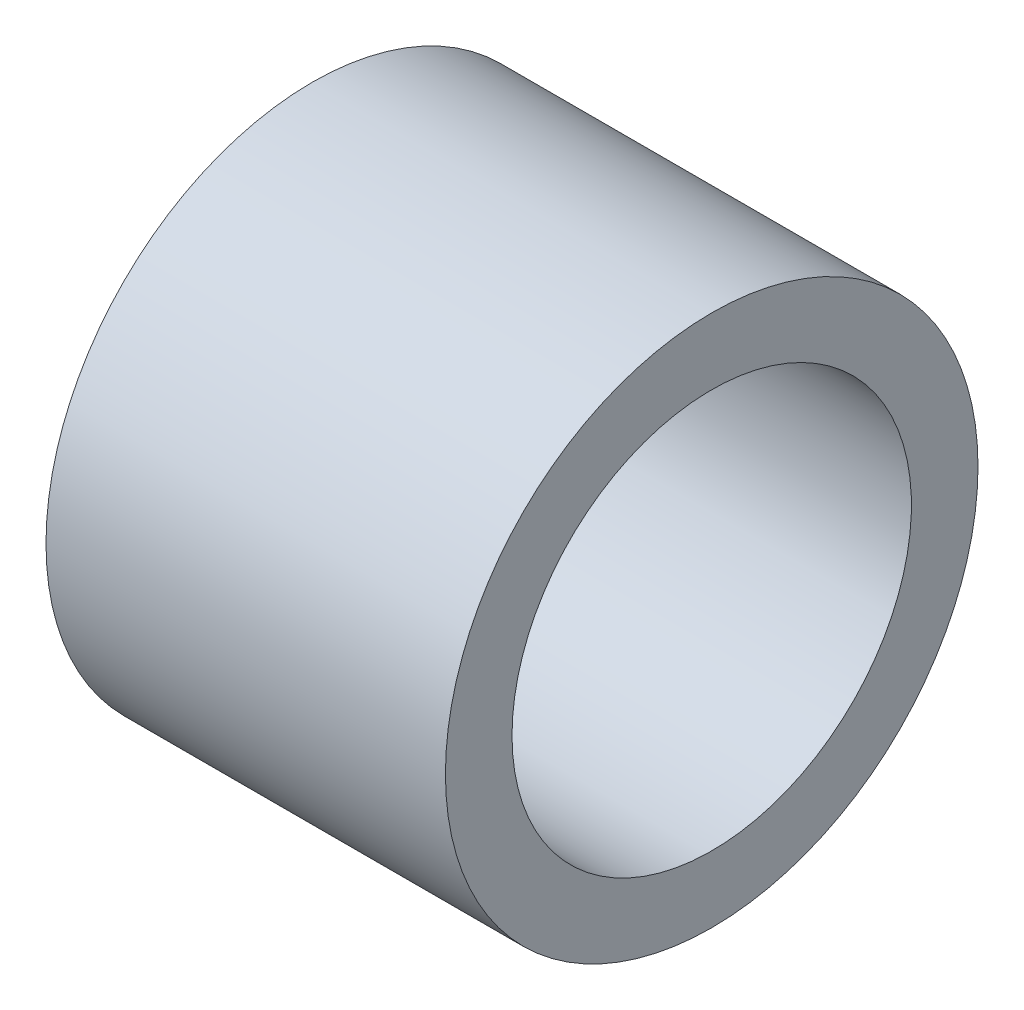
ISO-10303-21;
HEADER;
FILE_DESCRIPTION(('STEP AP214'),'2;1');
FILE_NAME('part.step','',(''),(''),'','','');
FILE_SCHEMA(('AUTOMOTIVE_DESIGN { 1 0 10303 214 1 1 1 1 }'));
ENDSEC;
DATA;
#1=APPLICATION_CONTEXT('core data for automotive mechanical design processes');
#2=APPLICATION_PROTOCOL_DEFINITION('international standard','automotive_design',2000,#1);
#3=PRODUCT_CONTEXT('',#1,'mechanical');
#4=PRODUCT('Part','Part','',(#3));
#5=PRODUCT_RELATED_PRODUCT_CATEGORY('part','',(#4));
#6=PRODUCT_DEFINITION_FORMATION('','',#4);
#7=PRODUCT_DEFINITION_CONTEXT('part definition',#1,'design');
#8=PRODUCT_DEFINITION('design','',#6,#7);
#9=PRODUCT_DEFINITION_SHAPE('','',#8);
#10=(LENGTH_UNIT() NAMED_UNIT(*) SI_UNIT(.MILLI.,.METRE.));
#11=(NAMED_UNIT(*) PLANE_ANGLE_UNIT() SI_UNIT($,.RADIAN.));
#12=(NAMED_UNIT(*) SI_UNIT($,.STERADIAN.) SOLID_ANGLE_UNIT());
#13=UNCERTAINTY_MEASURE_WITH_UNIT(LENGTH_MEASURE(1.E-05),#10,'distance_accuracy_value','');
#14=(GEOMETRIC_REPRESENTATION_CONTEXT(3) GLOBAL_UNCERTAINTY_ASSIGNED_CONTEXT((#13)) GLOBAL_UNIT_ASSIGNED_CONTEXT((#10,
#11,#12)) REPRESENTATION_CONTEXT('',''));
#15=CARTESIAN_POINT('',(0.,0.,0.));
#16=DIRECTION('',(0.,0.,1.));
#17=DIRECTION('',(1.,0.,0.));
#18=AXIS2_PLACEMENT_3D('',#15,#16,#17);
#19=CARTESIAN_POINT('',(9.525,0.,0.));
#20=DIRECTION('',(1.,0.,0.));
#21=DIRECTION('',(0.,0.,-1.));
#22=AXIS2_PLACEMENT_3D('',#19,#20,#21);
#23=PLANE('',#22);
#24=CARTESIAN_POINT('',(9.525,0.,0.));
#25=DIRECTION('',(1.,0.,0.));
#26=DIRECTION('',(0.,0.,-1.));
#27=AXIS2_PLACEMENT_3D('',#24,#25,#26);
#28=CIRCLE('',#27,12.7);
#29=CARTESIAN_POINT('',(9.525,0.,12.7));
#30=VERTEX_POINT('',#29);
#31=EDGE_CURVE('E10',#30,#30,#28,.T.);
#32=ORIENTED_EDGE('',*,*,#31,.T.);
#33=EDGE_LOOP('',(#32));
#34=FACE_BOUND('',#33,.T.);
#35=CARTESIAN_POINT('',(9.525,0.,0.));
#36=DIRECTION('',(1.,0.,0.));
#37=DIRECTION('',(0.,0.,-1.));
#38=AXIS2_PLACEMENT_3D('',#35,#36,#37);
#39=CIRCLE('',#38,9.525);
#40=CARTESIAN_POINT('',(9.525,0.,9.525));
#41=VERTEX_POINT('',#40);
#42=EDGE_CURVE('E56',#41,#41,#39,.T.);
#43=ORIENTED_EDGE('',*,*,#42,.F.);
#44=EDGE_LOOP('',(#43));
#45=FACE_BOUND('',#44,.T.);
#46=ADVANCED_FACE('F43',(#34,#45),#23,.T.);
#47=CARTESIAN_POINT('',(-9.525,0.,0.));
#48=DIRECTION('',(1.,0.,0.));
#49=DIRECTION('',(0.,0.,-1.));
#50=AXIS2_PLACEMENT_3D('',#47,#48,#49);
#51=PLANE('',#50);
#52=CARTESIAN_POINT('',(-9.525,0.,0.));
#53=DIRECTION('',(1.,0.,0.));
#54=DIRECTION('',(0.,0.,-1.));
#55=AXIS2_PLACEMENT_3D('',#52,#53,#54);
#56=CIRCLE('',#55,12.7);
#57=CARTESIAN_POINT('',(-9.525,0.,12.7));
#58=VERTEX_POINT('',#57);
#59=EDGE_CURVE('E47',#58,#58,#56,.T.);
#60=ORIENTED_EDGE('',*,*,#59,.F.);
#61=EDGE_LOOP('',(#60));
#62=FACE_BOUND('',#61,.T.);
#63=CARTESIAN_POINT('',(-9.525,0.,0.));
#64=DIRECTION('',(1.,0.,0.));
#65=DIRECTION('',(0.,0.,-1.));
#66=AXIS2_PLACEMENT_3D('',#63,#64,#65);
#67=CIRCLE('',#66,9.525);
#68=CARTESIAN_POINT('',(-9.525,0.,9.525));
#69=VERTEX_POINT('',#68);
#70=EDGE_CURVE('E58',#69,#69,#67,.T.);
#71=ORIENTED_EDGE('',*,*,#70,.T.);
#72=EDGE_LOOP('',(#71));
#73=FACE_BOUND('',#72,.T.);
#74=ADVANCED_FACE('F70',(#62,#73),#51,.F.);
#75=CARTESIAN_POINT('',(9.525,0.,0.));
#76=DIRECTION('',(-1.,0.,0.));
#77=DIRECTION('',(0.,0.,1.));
#78=AXIS2_PLACEMENT_3D('',#75,#76,#77);
#79=CYLINDRICAL_SURFACE('',#78,12.7);
#80=CARTESIAN_POINT('',(9.525,0.,12.7));
#81=CARTESIAN_POINT('',(9.3265625,0.,12.7));
#82=CARTESIAN_POINT('',(9.128125,0.,12.7));
#83=CARTESIAN_POINT('',(8.73125,0.,12.7));
#84=CARTESIAN_POINT('',(8.5328125,0.,12.7));
#85=CARTESIAN_POINT('',(8.1359375,0.,12.7));
#86=CARTESIAN_POINT('',(7.9375,0.,12.7));
#87=CARTESIAN_POINT('',(7.540625,0.,12.7));
#88=CARTESIAN_POINT('',(7.3421875,0.,12.7));
#89=CARTESIAN_POINT('',(6.9453125,0.,12.7));
#90=CARTESIAN_POINT('',(6.746875,0.,12.7));
#91=CARTESIAN_POINT('',(6.35,0.,12.7));
#92=CARTESIAN_POINT('',(6.1515625,0.,12.7));
#93=CARTESIAN_POINT('',(5.7546875,0.,12.7));
#94=CARTESIAN_POINT('',(5.55625,0.,12.7));
#95=CARTESIAN_POINT('',(5.159375,0.,12.7));
#96=CARTESIAN_POINT('',(4.9609375,0.,12.7));
#97=CARTESIAN_POINT('',(4.5640625,0.,12.7));
#98=CARTESIAN_POINT('',(4.365625,0.,12.7));
#99=CARTESIAN_POINT('',(3.96875,0.,12.7));
#100=CARTESIAN_POINT('',(3.7703125,0.,12.7));
#101=CARTESIAN_POINT('',(3.3734375,0.,12.7));
#102=CARTESIAN_POINT('',(3.175,0.,12.7));
#103=CARTESIAN_POINT('',(2.778125,0.,12.7));
#104=CARTESIAN_POINT('',(2.5796875,0.,12.7));
#105=CARTESIAN_POINT('',(2.1828125,0.,12.7));
#106=CARTESIAN_POINT('',(1.984375,0.,12.7));
#107=CARTESIAN_POINT('',(1.5875,0.,12.7));
#108=CARTESIAN_POINT('',(1.3890625,0.,12.7));
#109=CARTESIAN_POINT('',(0.992187499999999,0.,12.7));
#110=CARTESIAN_POINT('',(0.793749999999999,0.,12.7));
#111=CARTESIAN_POINT('',(0.396874999999998,0.,12.7));
#112=CARTESIAN_POINT('',(0.198437499999998,0.,12.7));
#113=CARTESIAN_POINT('',(-0.198437500000002,0.,12.7));
#114=CARTESIAN_POINT('',(-0.396875000000002,0.,12.7));
#115=CARTESIAN_POINT('',(-0.793750000000002,0.,12.7));
#116=CARTESIAN_POINT('',(-0.992187500000002,0.,12.7));
#117=CARTESIAN_POINT('',(-1.3890625,0.,12.7));
#118=CARTESIAN_POINT('',(-1.5875,0.,12.7));
#119=CARTESIAN_POINT('',(-1.984375,0.,12.7));
#120=CARTESIAN_POINT('',(-2.1828125,0.,12.7));
#121=CARTESIAN_POINT('',(-2.5796875,0.,12.7));
#122=CARTESIAN_POINT('',(-2.778125,0.,12.7));
#123=CARTESIAN_POINT('',(-3.175,0.,12.7));
#124=CARTESIAN_POINT('',(-3.3734375,0.,12.7));
#125=CARTESIAN_POINT('',(-3.7703125,0.,12.7));
#126=CARTESIAN_POINT('',(-3.96875,0.,12.7));
#127=CARTESIAN_POINT('',(-4.365625,0.,12.7));
#128=CARTESIAN_POINT('',(-4.5640625,0.,12.7));
#129=CARTESIAN_POINT('',(-4.9609375,0.,12.7));
#130=CARTESIAN_POINT('',(-5.159375,0.,12.7));
#131=CARTESIAN_POINT('',(-5.55625,0.,12.7));
#132=CARTESIAN_POINT('',(-5.7546875,0.,12.7));
#133=CARTESIAN_POINT('',(-6.1515625,0.,12.7));
#134=CARTESIAN_POINT('',(-6.35,0.,12.7));
#135=CARTESIAN_POINT('',(-6.746875,0.,12.7));
#136=CARTESIAN_POINT('',(-6.9453125,0.,12.7));
#137=CARTESIAN_POINT('',(-7.3421875,0.,12.7));
#138=CARTESIAN_POINT('',(-7.540625,0.,12.7));
#139=CARTESIAN_POINT('',(-7.9375,0.,12.7));
#140=CARTESIAN_POINT('',(-8.1359375,0.,12.7));
#141=CARTESIAN_POINT('',(-8.5328125,0.,12.7));
#142=CARTESIAN_POINT('',(-8.73125,0.,12.7));
#143=CARTESIAN_POINT('',(-9.128125,0.,12.7));
#144=CARTESIAN_POINT('',(-9.3265625,0.,12.7));
#145=CARTESIAN_POINT('',(-9.525,0.,12.7));
#146=B_SPLINE_CURVE_WITH_KNOTS('',3,(#80,#81,#82,#83,#84,#85,#86,#87,#88,#89,#90,#91,#92,#93,
#94,#95,#96,#97,#98,#99,#100,#101,#102,#103,#104,#105,#106,#107,#108,#109,#110,#111,#112,#113,
#114,#115,#116,#117,#118,#119,#120,#121,#122,#123,#124,#125,#126,#127,#128,#129,#130,#131,#132,
#133,#134,#135,#136,#137,#138,#139,#140,#141,#142,#143,#144,#145),.UNSPECIFIED.,.F.,.F.,(4,2,2,
2,2,2,2,2,2,2,2,2,2,2,2,2,2,2,2,2,2,2,2,2,2,2,2,2,2,2,2,2,4),(0.,0.595312499999999,1.190625,
1.7859375,2.38125,2.9765625,3.571875,4.1671875,4.7625,5.3578125,5.953125,6.5484375,7.14375,
7.7390625,8.334375,8.9296875,9.525,10.1203125,10.715625,11.3109375,11.90625,12.5015625,
13.096875,13.6921875,14.2875,14.8828125,15.478125,16.0734375,16.66875,17.2640625,17.859375,
18.4546875,19.05),.UNSPECIFIED.);
#147=EDGE_CURVE('BSEAM45',#30,#58,#146,.T.);
#148=ORIENTED_EDGE('',*,*,#31,.F.);
#149=ORIENTED_EDGE('',*,*,#59,.T.);
#150=ORIENTED_EDGE('',*,*,#147,.T.);
#151=ORIENTED_EDGE('',*,*,#147,.F.);
#152=EDGE_LOOP('',(#148,#150,#149,#151));
#153=FACE_BOUND('',#152,.T.);
#154=ADVANCED_FACE('F45',(#153),#79,.T.);
#155=CARTESIAN_POINT('',(9.525,0.,0.));
#156=DIRECTION('',(-1.,0.,0.));
#157=DIRECTION('',(0.,0.,1.));
#158=AXIS2_PLACEMENT_3D('',#155,#156,#157);
#159=CYLINDRICAL_SURFACE('',#158,9.525);
#160=CARTESIAN_POINT('',(9.525,0.,9.525));
#161=CARTESIAN_POINT('',(9.3265625,0.,9.525));
#162=CARTESIAN_POINT('',(9.128125,0.,9.525));
#163=CARTESIAN_POINT('',(8.73125,0.,9.525));
#164=CARTESIAN_POINT('',(8.5328125,0.,9.525));
#165=CARTESIAN_POINT('',(8.1359375,0.,9.525));
#166=CARTESIAN_POINT('',(7.9375,0.,9.525));
#167=CARTESIAN_POINT('',(7.540625,0.,9.525));
#168=CARTESIAN_POINT('',(7.3421875,0.,9.525));
#169=CARTESIAN_POINT('',(6.9453125,0.,9.525));
#170=CARTESIAN_POINT('',(6.746875,0.,9.525));
#171=CARTESIAN_POINT('',(6.35,0.,9.525));
#172=CARTESIAN_POINT('',(6.1515625,0.,9.525));
#173=CARTESIAN_POINT('',(5.7546875,0.,9.525));
#174=CARTESIAN_POINT('',(5.55625,0.,9.525));
#175=CARTESIAN_POINT('',(5.159375,0.,9.525));
#176=CARTESIAN_POINT('',(4.9609375,0.,9.525));
#177=CARTESIAN_POINT('',(4.5640625,0.,9.525));
#178=CARTESIAN_POINT('',(4.365625,0.,9.525));
#179=CARTESIAN_POINT('',(3.96875,0.,9.525));
#180=CARTESIAN_POINT('',(3.7703125,0.,9.525));
#181=CARTESIAN_POINT('',(3.3734375,0.,9.525));
#182=CARTESIAN_POINT('',(3.175,0.,9.525));
#183=CARTESIAN_POINT('',(2.778125,0.,9.525));
#184=CARTESIAN_POINT('',(2.5796875,0.,9.525));
#185=CARTESIAN_POINT('',(2.1828125,0.,9.525));
#186=CARTESIAN_POINT('',(1.984375,0.,9.525));
#187=CARTESIAN_POINT('',(1.5875,0.,9.525));
#188=CARTESIAN_POINT('',(1.3890625,0.,9.525));
#189=CARTESIAN_POINT('',(0.992187500000001,0.,9.525));
#190=CARTESIAN_POINT('',(0.793750000000001,0.,9.525));
#191=CARTESIAN_POINT('',(0.396875,0.,9.525));
#192=CARTESIAN_POINT('',(0.1984375,0.,9.525));
#193=CARTESIAN_POINT('',(-0.1984375,0.,9.525));
#194=CARTESIAN_POINT('',(-0.396875,0.,9.525));
#195=CARTESIAN_POINT('',(-0.793750000000001,0.,9.525));
#196=CARTESIAN_POINT('',(-0.992187500000001,0.,9.525));
#197=CARTESIAN_POINT('',(-1.3890625,0.,9.525));
#198=CARTESIAN_POINT('',(-1.5875,0.,9.525));
#199=CARTESIAN_POINT('',(-1.984375,0.,9.525));
#200=CARTESIAN_POINT('',(-2.1828125,0.,9.525));
#201=CARTESIAN_POINT('',(-2.5796875,0.,9.525));
#202=CARTESIAN_POINT('',(-2.778125,0.,9.525));
#203=CARTESIAN_POINT('',(-3.175,0.,9.525));
#204=CARTESIAN_POINT('',(-3.3734375,0.,9.525));
#205=CARTESIAN_POINT('',(-3.7703125,0.,9.525));
#206=CARTESIAN_POINT('',(-3.96875,0.,9.525));
#207=CARTESIAN_POINT('',(-4.365625,0.,9.525));
#208=CARTESIAN_POINT('',(-4.5640625,0.,9.525));
#209=CARTESIAN_POINT('',(-4.9609375,0.,9.525));
#210=CARTESIAN_POINT('',(-5.159375,0.,9.525));
#211=CARTESIAN_POINT('',(-5.55625,0.,9.525));
#212=CARTESIAN_POINT('',(-5.7546875,0.,9.525));
#213=CARTESIAN_POINT('',(-6.1515625,0.,9.525));
#214=CARTESIAN_POINT('',(-6.35,0.,9.525));
#215=CARTESIAN_POINT('',(-6.746875,0.,9.525));
#216=CARTESIAN_POINT('',(-6.9453125,0.,9.525));
#217=CARTESIAN_POINT('',(-7.3421875,0.,9.525));
#218=CARTESIAN_POINT('',(-7.540625,0.,9.525));
#219=CARTESIAN_POINT('',(-7.9375,0.,9.525));
#220=CARTESIAN_POINT('',(-8.1359375,0.,9.525));
#221=CARTESIAN_POINT('',(-8.5328125,0.,9.525));
#222=CARTESIAN_POINT('',(-8.73125,0.,9.525));
#223=CARTESIAN_POINT('',(-9.128125,0.,9.525));
#224=CARTESIAN_POINT('',(-9.3265625,0.,9.525));
#225=CARTESIAN_POINT('',(-9.525,0.,9.525));
#226=B_SPLINE_CURVE_WITH_KNOTS('',3,(#160,#161,#162,#163,#164,#165,#166,#167,#168,#169,#170,
#171,#172,#173,#174,#175,#176,#177,#178,#179,#180,#181,#182,#183,#184,#185,#186,#187,#188,#189,
#190,#191,#192,#193,#194,#195,#196,#197,#198,#199,#200,#201,#202,#203,#204,#205,#206,#207,#208,
#209,#210,#211,#212,#213,#214,#215,#216,#217,#218,#219,#220,#221,#222,#223,#224,#225),
.UNSPECIFIED.,.F.,.F.,(4,2,2,2,2,2,2,2,2,2,2,2,2,2,2,2,2,2,2,2,2,2,2,2,2,2,2,2,2,2,2,2,4),(0.,
0.5953125,1.190625,1.7859375,2.38125,2.9765625,3.571875,4.1671875,4.7625,5.3578125,5.953125,
6.5484375,7.14375,7.7390625,8.334375,8.9296875,9.525,10.1203125,10.715625,11.3109375,11.90625,
12.5015625,13.096875,13.6921875,14.2875,14.8828125,15.478125,16.0734375,16.66875,17.2640625,
17.859375,18.4546875,19.05),.UNSPECIFIED.);
#227=EDGE_CURVE('BSEAM66',#41,#69,#226,.T.);
#228=ORIENTED_EDGE('',*,*,#42,.T.);
#229=ORIENTED_EDGE('',*,*,#70,.F.);
#230=ORIENTED_EDGE('',*,*,#227,.T.);
#231=ORIENTED_EDGE('',*,*,#227,.F.);
#232=EDGE_LOOP('',(#228,#230,#229,#231));
#233=FACE_BOUND('',#232,.T.);
#234=ADVANCED_FACE('F66',(#233),#159,.F.);
#235=CLOSED_SHELL('',(#46,#74,#154,#234));
#236=MANIFOLD_SOLID_BREP('B2',#235);
#237=ADVANCED_BREP_SHAPE_REPRESENTATION('',(#18,#236),#14);
#238=SHAPE_DEFINITION_REPRESENTATION(#9,#237);
ENDSEC;
END-ISO-10303-21;
